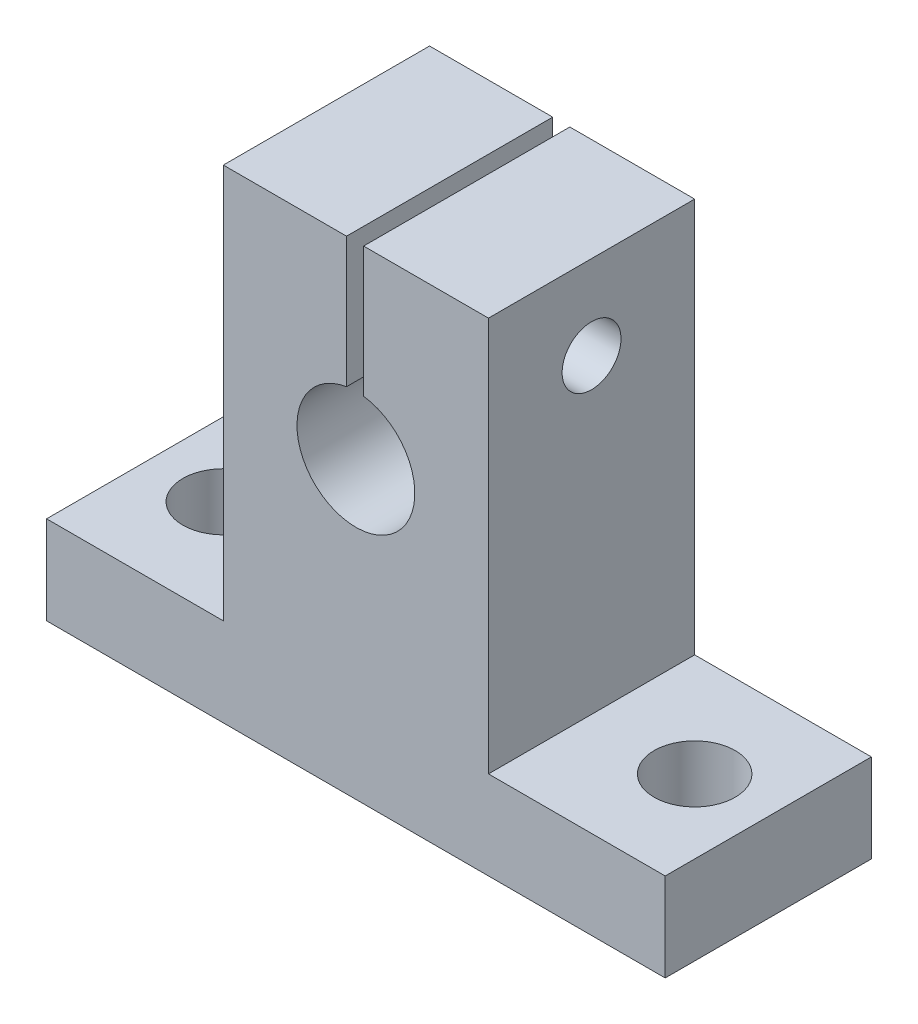
ISO-10303-21;
HEADER;
FILE_DESCRIPTION(('STEP AP214'),'2;1');
FILE_NAME('part.step','',(''),(''),'','','');
FILE_SCHEMA(('AUTOMOTIVE_DESIGN { 1 0 10303 214 1 1 1 1 }'));
ENDSEC;
DATA;
#1=APPLICATION_CONTEXT('core data for automotive mechanical design processes');
#2=APPLICATION_PROTOCOL_DEFINITION('international standard','automotive_design',2000,#1);
#3=PRODUCT_CONTEXT('',#1,'mechanical');
#4=PRODUCT('Part','Part','',(#3));
#5=PRODUCT_RELATED_PRODUCT_CATEGORY('part','',(#4));
#6=PRODUCT_DEFINITION_FORMATION('','',#4);
#7=PRODUCT_DEFINITION_CONTEXT('part definition',#1,'design');
#8=PRODUCT_DEFINITION('design','',#6,#7);
#9=PRODUCT_DEFINITION_SHAPE('','',#8);
#10=(LENGTH_UNIT() NAMED_UNIT(*) SI_UNIT(.MILLI.,.METRE.));
#11=(NAMED_UNIT(*) PLANE_ANGLE_UNIT() SI_UNIT($,.RADIAN.));
#12=(NAMED_UNIT(*) SI_UNIT($,.STERADIAN.) SOLID_ANGLE_UNIT());
#13=UNCERTAINTY_MEASURE_WITH_UNIT(LENGTH_MEASURE(1.E-05),#10,'distance_accuracy_value','');
#14=(GEOMETRIC_REPRESENTATION_CONTEXT(3) GLOBAL_UNCERTAINTY_ASSIGNED_CONTEXT((#13)) GLOBAL_UNIT_ASSIGNED_CONTEXT((#10,
#11,#12)) REPRESENTATION_CONTEXT('',''));
#15=CARTESIAN_POINT('',(0.,0.,0.));
#16=DIRECTION('',(0.,0.,1.));
#17=DIRECTION('',(1.,0.,0.));
#18=AXIS2_PLACEMENT_3D('',#15,#16,#17);
#19=CARTESIAN_POINT('',(0.,32.8,0.));
#20=DIRECTION('',(0.,1.,0.));
#21=DIRECTION('',(0.,0.,1.));
#22=AXIS2_PLACEMENT_3D('',#19,#20,#21);
#23=PLANE('',#22);
#24=DIRECTION('',(0.,0.,-1.));
#25=VECTOR('',#24,1.);
#26=CARTESIAN_POINT('',(7.16691514659286,32.8,8.10019646365425));
#27=LINE('',#26,#25);
#28=CARTESIAN_POINT('',(7.16691514659286,32.8,8.10019646365425));
#29=VERTEX_POINT('',#28);
#30=CARTESIAN_POINT('',(7.16691514659286,32.8,-5.89980353634575));
#31=VERTEX_POINT('',#30);
#32=EDGE_CURVE('E131',#29,#31,#27,.T.);
#33=ORIENTED_EDGE('',*,*,#32,.F.);
#34=DIRECTION('',(1.,0.,0.));
#35=VECTOR('',#34,1.);
#36=CARTESIAN_POINT('',(-2.35756385068762,32.8,8.10019646365425));
#37=LINE('',#36,#35);
#38=CARTESIAN_POINT('',(15.6424361493124,32.8,8.10019646365424));
#39=VERTEX_POINT('',#38);
#40=EDGE_CURVE('E151',#29,#39,#37,.T.);
#41=ORIENTED_EDGE('',*,*,#40,.T.);
#42=DIRECTION('',(0.,0.,-1.));
#43=VECTOR('',#42,1.);
#44=CARTESIAN_POINT('',(15.6424361493124,32.8,-5.89980353634575));
#45=LINE('',#44,#43);
#46=CARTESIAN_POINT('',(15.6424361493124,32.8,-5.89980353634575));
#47=VERTEX_POINT('',#46);
#48=EDGE_CURVE('E150',#39,#47,#45,.T.);
#49=ORIENTED_EDGE('',*,*,#48,.T.);
#50=DIRECTION('',(-1.,0.,0.));
#51=VECTOR('',#50,1.);
#52=CARTESIAN_POINT('',(-2.35756385068762,32.8,-5.89980353634575));
#53=LINE('',#52,#51);
#54=EDGE_CURVE('E158',#47,#31,#53,.T.);
#55=ORIENTED_EDGE('',*,*,#54,.T.);
#56=EDGE_LOOP('',(#33,#41,#49,#55));
#57=FACE_BOUND('',#56,.T.);
#58=ADVANCED_FACE('F37',(#57),#23,.T.);
#59=CARTESIAN_POINT('',(0.,6.,0.));
#60=DIRECTION('',(0.,1.,0.));
#61=DIRECTION('',(0.,0.,1.));
#62=AXIS2_PLACEMENT_3D('',#59,#60,#61);
#63=PLANE('',#62);
#64=DIRECTION('',(0.,0.,1.));
#65=VECTOR('',#64,1.);
#66=CARTESIAN_POINT('',(-2.35756385068762,6.,-5.89980353634575));
#67=LINE('',#66,#65);
#68=CARTESIAN_POINT('',(-2.35756385068762,6.,-5.89980353634575));
#69=VERTEX_POINT('',#68);
#70=CARTESIAN_POINT('',(-2.35756385068762,6.,8.10019646365425));
#71=VERTEX_POINT('',#70);
#72=EDGE_CURVE('E162',#69,#71,#67,.T.);
#73=ORIENTED_EDGE('',*,*,#72,.F.);
#74=DIRECTION('',(-1.,0.,0.));
#75=VECTOR('',#74,1.);
#76=CARTESIAN_POINT('',(-14.3575638506876,6.,-5.89980353634575));
#77=LINE('',#76,#75);
#78=CARTESIAN_POINT('',(-14.3575638506876,6.,-5.89980353634575));
#79=VERTEX_POINT('',#78);
#80=EDGE_CURVE('E201',#69,#79,#77,.T.);
#81=ORIENTED_EDGE('',*,*,#80,.T.);
#82=DIRECTION('',(0.,0.,1.));
#83=VECTOR('',#82,1.);
#84=CARTESIAN_POINT('',(-14.3575638506876,6.,-5.89980353634575));
#85=LINE('',#84,#83);
#86=CARTESIAN_POINT('',(-14.3575638506876,6.,8.10019646365425));
#87=VERTEX_POINT('',#86);
#88=EDGE_CURVE('E192',#79,#87,#85,.T.);
#89=ORIENTED_EDGE('',*,*,#88,.T.);
#90=DIRECTION('',(1.,0.,0.));
#91=VECTOR('',#90,1.);
#92=CARTESIAN_POINT('',(-14.3575638506876,6.,8.10019646365425));
#93=LINE('',#92,#91);
#94=EDGE_CURVE('E197',#87,#71,#93,.T.);
#95=ORIENTED_EDGE('',*,*,#94,.T.);
#96=EDGE_LOOP('',(#73,#81,#89,#95));
#97=FACE_BOUND('',#96,.T.);
#98=CARTESIAN_POINT('',(-9.35756385068762,6.,1.10019646365425));
#99=DIRECTION('',(0.,1.,0.));
#100=DIRECTION('',(0.,0.,1.));
#101=AXIS2_PLACEMENT_3D('',#98,#99,#100);
#102=CIRCLE('',#101,2.75);
#103=CARTESIAN_POINT('',(-9.35756385068762,6.,3.85019646365425));
#104=VERTEX_POINT('',#103);
#105=EDGE_CURVE('E184',#104,#104,#102,.T.);
#106=ORIENTED_EDGE('',*,*,#105,.F.);
#107=EDGE_LOOP('',(#106));
#108=FACE_BOUND('',#107,.T.);
#109=ADVANCED_FACE('F288',(#97,#108),#63,.T.);
#110=CARTESIAN_POINT('',(-14.3575638506876,6.,-5.89980353634575));
#111=DIRECTION('',(1.,0.,0.));
#112=DIRECTION('',(0.,0.,-1.));
#113=AXIS2_PLACEMENT_3D('',#110,#111,#112);
#114=PLANE('',#113);
#115=DIRECTION('',(0.,0.,1.));
#116=VECTOR('',#115,1.);
#117=CARTESIAN_POINT('',(-14.3575638506876,0.,-5.89980353634575));
#118=LINE('',#117,#116);
#119=CARTESIAN_POINT('',(-14.3575638506876,0.,-5.89980353634575));
#120=VERTEX_POINT('',#119);
#121=CARTESIAN_POINT('',(-14.3575638506876,0.,8.10019646365425));
#122=VERTEX_POINT('',#121);
#123=EDGE_CURVE('E183',#120,#122,#118,.T.);
#124=ORIENTED_EDGE('',*,*,#123,.T.);
#125=DIRECTION('',(0.,-1.,0.));
#126=VECTOR('',#125,1.);
#127=CARTESIAN_POINT('',(-14.3575638506876,6.,8.10019646365425));
#128=LINE('',#127,#126);
#129=EDGE_CURVE('E46',#87,#122,#128,.T.);
#130=ORIENTED_EDGE('',*,*,#129,.F.);
#131=ORIENTED_EDGE('',*,*,#88,.F.);
#132=DIRECTION('',(0.,-1.,0.));
#133=VECTOR('',#132,1.);
#134=CARTESIAN_POINT('',(-14.3575638506876,6.,-5.89980353634575));
#135=LINE('',#134,#133);
#136=EDGE_CURVE('E204',#79,#120,#135,.T.);
#137=ORIENTED_EDGE('',*,*,#136,.T.);
#138=EDGE_LOOP('',(#124,#130,#131,#137));
#139=FACE_BOUND('',#138,.T.);
#140=ADVANCED_FACE('F39',(#139),#114,.F.);
#141=CARTESIAN_POINT('',(-14.3575638506876,6.,8.10019646365425));
#142=DIRECTION('',(0.,0.,-1.));
#143=DIRECTION('',(-1.,0.,0.));
#144=AXIS2_PLACEMENT_3D('',#141,#142,#143);
#145=PLANE('',#144);
#146=ORIENTED_EDGE('',*,*,#40,.F.);
#147=DIRECTION('',(0.,-1.,0.));
#148=VECTOR('',#147,1.);
#149=CARTESIAN_POINT('',(7.16691514659286,32.8,8.10019646365425));
#150=LINE('',#149,#148);
#151=CARTESIAN_POINT('',(7.16691514659285,23.9654661493211,8.10019646365425));
#152=VERTEX_POINT('',#151);
#153=EDGE_CURVE('E144',#29,#152,#150,.T.);
#154=ORIENTED_EDGE('',*,*,#153,.T.);
#155=CARTESIAN_POINT('',(6.64243614931238,20.,8.10019646365425));
#156=DIRECTION('',(0.,0.,1.));
#157=DIRECTION('',(1.,0.,0.));
#158=AXIS2_PLACEMENT_3D('',#155,#156,#157);
#159=CIRCLE('',#158,4.);
#160=CARTESIAN_POINT('',(6.00568199429908,23.9489928014714,8.10019646365425));
#161=VERTEX_POINT('',#160);
#162=EDGE_CURVE('E143',#161,#152,#159,.T.);
#163=ORIENTED_EDGE('',*,*,#162,.F.);
#164=DIRECTION('',(0.,1.,0.));
#165=VECTOR('',#164,1.);
#166=CARTESIAN_POINT('',(6.00568199429908,32.8,8.10019646365425));
#167=LINE('',#166,#165);
#168=CARTESIAN_POINT('',(6.00568199429908,32.8,8.10019646365425));
#169=VERTEX_POINT('',#168);
#170=EDGE_CURVE('E53',#161,#169,#167,.T.);
#171=ORIENTED_EDGE('',*,*,#170,.T.);
#172=CARTESIAN_POINT('',(-2.35756385068762,32.8,8.10019646365425));
#173=VERTEX_POINT('',#172);
#174=EDGE_CURVE('E139',#173,#169,#37,.T.);
#175=ORIENTED_EDGE('',*,*,#174,.F.);
#176=DIRECTION('',(0.,-1.,0.));
#177=VECTOR('',#176,1.);
#178=CARTESIAN_POINT('',(-2.35756385068762,32.8,8.10019646365425));
#179=LINE('',#178,#177);
#180=EDGE_CURVE('E177',#173,#71,#179,.T.);
#181=ORIENTED_EDGE('',*,*,#180,.T.);
#182=ORIENTED_EDGE('',*,*,#94,.F.);
#183=ORIENTED_EDGE('',*,*,#129,.T.);
#184=DIRECTION('',(1.,0.,0.));
#185=VECTOR('',#184,1.);
#186=CARTESIAN_POINT('',(-14.3575638506876,0.,8.10019646365425));
#187=LINE('',#186,#185);
#188=CARTESIAN_POINT('',(27.6424361493124,0.,8.10019646365425));
#189=VERTEX_POINT('',#188);
#190=EDGE_CURVE('E207',#122,#189,#187,.T.);
#191=ORIENTED_EDGE('',*,*,#190,.T.);
#192=DIRECTION('',(0.,-1.,0.));
#193=VECTOR('',#192,1.);
#194=CARTESIAN_POINT('',(27.6424361493124,6.,8.10019646365425));
#195=LINE('',#194,#193);
#196=CARTESIAN_POINT('',(27.6424361493124,6.,8.10019646365425));
#197=VERTEX_POINT('',#196);
#198=EDGE_CURVE('E217',#197,#189,#195,.T.);
#199=ORIENTED_EDGE('',*,*,#198,.F.);
#200=CARTESIAN_POINT('',(15.6424361493124,6.,8.10019646365425));
#201=VERTEX_POINT('',#200);
#202=EDGE_CURVE('E195',#201,#197,#93,.T.);
#203=ORIENTED_EDGE('',*,*,#202,.F.);
#204=DIRECTION('',(0.,-1.,0.));
#205=VECTOR('',#204,1.);
#206=CARTESIAN_POINT('',(15.6424361493124,32.8,8.10019646365424));
#207=LINE('',#206,#205);
#208=EDGE_CURVE('E174',#39,#201,#207,.T.);
#209=ORIENTED_EDGE('',*,*,#208,.F.);
#210=EDGE_LOOP('',(#146,#154,#163,#171,#175,#181,#182,#183,#191,#199,#203,#209));
#211=FACE_BOUND('',#210,.T.);
#212=ADVANCED_FACE('F137',(#211),#145,.F.);
#213=CARTESIAN_POINT('',(27.6424361493124,6.,-5.89980353634575));
#214=DIRECTION('',(-1.,0.,0.));
#215=DIRECTION('',(0.,0.,1.));
#216=AXIS2_PLACEMENT_3D('',#213,#214,#215);
#217=PLANE('',#216);
#218=DIRECTION('',(0.,0.,-1.));
#219=VECTOR('',#218,1.);
#220=CARTESIAN_POINT('',(27.6424361493124,0.,-5.89980353634575));
#221=LINE('',#220,#219);
#222=CARTESIAN_POINT('',(27.6424361493124,0.,-5.89980353634575));
#223=VERTEX_POINT('',#222);
#224=EDGE_CURVE('E209',#189,#223,#221,.T.);
#225=ORIENTED_EDGE('',*,*,#224,.T.);
#226=DIRECTION('',(0.,-1.,0.));
#227=VECTOR('',#226,1.);
#228=CARTESIAN_POINT('',(27.6424361493124,6.,-5.89980353634575));
#229=LINE('',#228,#227);
#230=CARTESIAN_POINT('',(27.6424361493124,6.,-5.89980353634575));
#231=VERTEX_POINT('',#230);
#232=EDGE_CURVE('E214',#231,#223,#229,.T.);
#233=ORIENTED_EDGE('',*,*,#232,.F.);
#234=DIRECTION('',(0.,0.,-1.));
#235=VECTOR('',#234,1.);
#236=CARTESIAN_POINT('',(27.6424361493124,6.,-5.89980353634575));
#237=LINE('',#236,#235);
#238=EDGE_CURVE('E199',#197,#231,#237,.T.);
#239=ORIENTED_EDGE('',*,*,#238,.F.);
#240=ORIENTED_EDGE('',*,*,#198,.T.);
#241=EDGE_LOOP('',(#225,#233,#239,#240));
#242=FACE_BOUND('',#241,.T.);
#243=ADVANCED_FACE('F233',(#242),#217,.F.);
#244=CARTESIAN_POINT('',(-14.3575638506876,6.,-5.89980353634575));
#245=DIRECTION('',(0.,0.,1.));
#246=DIRECTION('',(1.,0.,0.));
#247=AXIS2_PLACEMENT_3D('',#244,#245,#246);
#248=PLANE('',#247);
#249=CARTESIAN_POINT('',(6.64243614931238,20.,-5.89980353634575));
#250=DIRECTION('',(0.,0.,1.));
#251=DIRECTION('',(1.,0.,0.));
#252=AXIS2_PLACEMENT_3D('',#249,#250,#251);
#253=CIRCLE('',#252,4.);
#254=CARTESIAN_POINT('',(6.00568199429908,23.9489928014714,-5.89980353634575));
#255=VERTEX_POINT('',#254);
#256=CARTESIAN_POINT('',(7.16691514659285,23.9654661493211,-5.89980353634575));
#257=VERTEX_POINT('',#256);
#258=EDGE_CURVE('E166',#255,#257,#253,.T.);
#259=ORIENTED_EDGE('',*,*,#258,.T.);
#260=DIRECTION('',(0.,-1.,0.));
#261=VECTOR('',#260,1.);
#262=CARTESIAN_POINT('',(7.16691514659286,32.8,-5.89980353634575));
#263=LINE('',#262,#261);
#264=EDGE_CURVE('E61',#31,#257,#263,.T.);
#265=ORIENTED_EDGE('',*,*,#264,.F.);
#266=ORIENTED_EDGE('',*,*,#54,.F.);
#267=DIRECTION('',(0.,-1.,0.));
#268=VECTOR('',#267,1.);
#269=CARTESIAN_POINT('',(15.6424361493124,32.8,-5.89980353634575));
#270=LINE('',#269,#268);
#271=CARTESIAN_POINT('',(15.6424361493124,6.,-5.89980353634575));
#272=VERTEX_POINT('',#271);
#273=EDGE_CURVE('E171',#47,#272,#270,.T.);
#274=ORIENTED_EDGE('',*,*,#273,.T.);
#275=EDGE_CURVE('E202',#231,#272,#77,.T.);
#276=ORIENTED_EDGE('',*,*,#275,.F.);
#277=ORIENTED_EDGE('',*,*,#232,.T.);
#278=DIRECTION('',(-1.,0.,0.));
#279=VECTOR('',#278,1.);
#280=CARTESIAN_POINT('',(-14.3575638506876,0.,-5.89980353634575));
#281=LINE('',#280,#279);
#282=EDGE_CURVE('E196',#223,#120,#281,.T.);
#283=ORIENTED_EDGE('',*,*,#282,.T.);
#284=ORIENTED_EDGE('',*,*,#136,.F.);
#285=ORIENTED_EDGE('',*,*,#80,.F.);
#286=DIRECTION('',(0.,-1.,0.));
#287=VECTOR('',#286,1.);
#288=CARTESIAN_POINT('',(-2.35756385068762,32.8,-5.89980353634575));
#289=LINE('',#288,#287);
#290=CARTESIAN_POINT('',(-2.35756385068762,32.8,-5.89980353634575));
#291=VERTEX_POINT('',#290);
#292=EDGE_CURVE('E161',#291,#69,#289,.T.);
#293=ORIENTED_EDGE('',*,*,#292,.F.);
#294=CARTESIAN_POINT('',(6.00568199429908,32.8,-5.89980353634575));
#295=VERTEX_POINT('',#294);
#296=EDGE_CURVE('E153',#295,#291,#53,.T.);
#297=ORIENTED_EDGE('',*,*,#296,.F.);
#298=DIRECTION('',(0.,1.,0.));
#299=VECTOR('',#298,1.);
#300=CARTESIAN_POINT('',(6.00568199429908,32.8,-5.89980353634575));
#301=LINE('',#300,#299);
#302=EDGE_CURVE('E127',#255,#295,#301,.T.);
#303=ORIENTED_EDGE('',*,*,#302,.F.);
#304=EDGE_LOOP('',(#259,#265,#266,#274,#276,#277,#283,#284,#285,#293,#297,#303));
#305=FACE_BOUND('',#304,.T.);
#306=ADVANCED_FACE('F238',(#305),#248,.F.);
#307=DIRECTION('',(0.,0.,-1.));
#308=VECTOR('',#307,1.);
#309=CARTESIAN_POINT('',(15.6424361493124,6.,-5.89980353634575));
#310=LINE('',#309,#308);
#311=EDGE_CURVE('E165',#201,#272,#310,.T.);
#312=ORIENTED_EDGE('',*,*,#311,.F.);
#313=ORIENTED_EDGE('',*,*,#202,.T.);
#314=ORIENTED_EDGE('',*,*,#238,.T.);
#315=ORIENTED_EDGE('',*,*,#275,.T.);
#316=EDGE_LOOP('',(#312,#313,#314,#315));
#317=FACE_BOUND('',#316,.T.);
#318=CARTESIAN_POINT('',(22.6424361493124,6.,1.10019646365425));
#319=DIRECTION('',(0.,1.,0.));
#320=DIRECTION('',(0.,0.,1.));
#321=AXIS2_PLACEMENT_3D('',#318,#319,#320);
#322=CIRCLE('',#321,2.75);
#323=CARTESIAN_POINT('',(22.6424361493124,6.,3.85019646365424));
#324=VERTEX_POINT('',#323);
#325=EDGE_CURVE('E179',#324,#324,#322,.T.);
#326=ORIENTED_EDGE('',*,*,#325,.F.);
#327=EDGE_LOOP('',(#326));
#328=FACE_BOUND('',#327,.T.);
#329=ADVANCED_FACE('F242',(#317,#328),#63,.T.);
#330=CARTESIAN_POINT('',(0.,0.,0.));
#331=DIRECTION('',(0.,1.,0.));
#332=DIRECTION('',(0.,0.,1.));
#333=AXIS2_PLACEMENT_3D('',#330,#331,#332);
#334=PLANE('',#333);
#335=CARTESIAN_POINT('',(-9.35756385068762,0.,1.10019646365425));
#336=DIRECTION('',(0.,1.,0.));
#337=DIRECTION('',(0.,0.,1.));
#338=AXIS2_PLACEMENT_3D('',#335,#336,#337);
#339=CIRCLE('',#338,2.75);
#340=CARTESIAN_POINT('',(-9.35756385068762,0.,3.85019646365425));
#341=VERTEX_POINT('',#340);
#342=EDGE_CURVE('E180',#341,#341,#339,.T.);
#343=ORIENTED_EDGE('',*,*,#342,.T.);
#344=EDGE_LOOP('',(#343));
#345=FACE_BOUND('',#344,.T.);
#346=CARTESIAN_POINT('',(22.6424361493124,0.,1.10019646365425));
#347=DIRECTION('',(0.,1.,0.));
#348=DIRECTION('',(0.,0.,1.));
#349=AXIS2_PLACEMENT_3D('',#346,#347,#348);
#350=CIRCLE('',#349,2.75);
#351=CARTESIAN_POINT('',(22.6424361493124,0.,3.85019646365424));
#352=VERTEX_POINT('',#351);
#353=EDGE_CURVE('E187',#352,#352,#350,.T.);
#354=ORIENTED_EDGE('',*,*,#353,.T.);
#355=EDGE_LOOP('',(#354));
#356=FACE_BOUND('',#355,.T.);
#357=ORIENTED_EDGE('',*,*,#123,.F.);
#358=ORIENTED_EDGE('',*,*,#282,.F.);
#359=ORIENTED_EDGE('',*,*,#224,.F.);
#360=ORIENTED_EDGE('',*,*,#190,.F.);
#361=EDGE_LOOP('',(#357,#358,#359,#360));
#362=FACE_BOUND('',#361,.T.);
#363=ADVANCED_FACE('F229',(#345,#356,#362),#334,.F.);
#364=CARTESIAN_POINT('',(22.6424361493124,0.,1.10019646365425));
#365=DIRECTION('',(0.,1.,0.));
#366=DIRECTION('',(0.,0.,1.));
#367=AXIS2_PLACEMENT_3D('',#364,#365,#366);
#368=CYLINDRICAL_SURFACE('',#367,2.75);
#369=ORIENTED_EDGE('',*,*,#353,.F.);
#370=EDGE_LOOP('',(#369));
#371=FACE_BOUND('',#370,.T.);
#372=ORIENTED_EDGE('',*,*,#325,.T.);
#373=EDGE_LOOP('',(#372));
#374=FACE_BOUND('',#373,.T.);
#375=ADVANCED_FACE('F295',(#371,#374),#368,.F.);
#376=CARTESIAN_POINT('',(-9.35756385068762,0.,1.10019646365425));
#377=DIRECTION('',(0.,1.,0.));
#378=DIRECTION('',(0.,0.,1.));
#379=AXIS2_PLACEMENT_3D('',#376,#377,#378);
#380=CYLINDRICAL_SURFACE('',#379,2.75);
#381=ORIENTED_EDGE('',*,*,#342,.F.);
#382=EDGE_LOOP('',(#381));
#383=FACE_BOUND('',#382,.T.);
#384=ORIENTED_EDGE('',*,*,#105,.T.);
#385=EDGE_LOOP('',(#384));
#386=FACE_BOUND('',#385,.T.);
#387=ADVANCED_FACE('F283',(#383,#386),#380,.F.);
#388=CARTESIAN_POINT('',(-2.35756385068762,32.8,-5.89980353634575));
#389=DIRECTION('',(1.,0.,0.));
#390=DIRECTION('',(0.,0.,-1.));
#391=AXIS2_PLACEMENT_3D('',#388,#389,#390);
#392=PLANE('',#391);
#393=CARTESIAN_POINT('',(-2.35756385068762,27.0916059656513,1.10019646365425));
#394=DIRECTION('',(-1.,0.,0.));
#395=DIRECTION('',(0.,0.,1.));
#396=AXIS2_PLACEMENT_3D('',#393,#394,#395);
#397=CIRCLE('',#396,2.);
#398=CARTESIAN_POINT('',(-2.35756385068762,27.0916059656513,3.10019646365425));
#399=VERTEX_POINT('',#398);
#400=EDGE_CURVE('E272',#399,#399,#397,.T.);
#401=ORIENTED_EDGE('',*,*,#400,.F.);
#402=EDGE_LOOP('',(#401));
#403=FACE_BOUND('',#402,.T.);
#404=ORIENTED_EDGE('',*,*,#72,.T.);
#405=ORIENTED_EDGE('',*,*,#180,.F.);
#406=DIRECTION('',(0.,0.,1.));
#407=VECTOR('',#406,1.);
#408=CARTESIAN_POINT('',(-2.35756385068762,32.8,-5.89980353634575));
#409=LINE('',#408,#407);
#410=EDGE_CURVE('E148',#291,#173,#409,.T.);
#411=ORIENTED_EDGE('',*,*,#410,.F.);
#412=ORIENTED_EDGE('',*,*,#292,.T.);
#413=EDGE_LOOP('',(#404,#405,#411,#412));
#414=FACE_BOUND('',#413,.T.);
#415=ADVANCED_FACE('F280',(#403,#414),#392,.F.);
#416=CARTESIAN_POINT('',(15.6424361493124,32.8,-5.89980353634575));
#417=DIRECTION('',(-1.,0.,0.));
#418=DIRECTION('',(0.,0.,1.));
#419=AXIS2_PLACEMENT_3D('',#416,#417,#418);
#420=PLANE('',#419);
#421=CARTESIAN_POINT('',(15.6424361493124,27.0916059656513,1.10019646365424));
#422=DIRECTION('',(-1.,0.,0.));
#423=DIRECTION('',(0.,0.,1.));
#424=AXIS2_PLACEMENT_3D('',#421,#422,#423);
#425=CIRCLE('',#424,2.);
#426=CARTESIAN_POINT('',(15.6424361493124,27.0916059656513,3.10019646365424));
#427=VERTEX_POINT('',#426);
#428=EDGE_CURVE('E262',#427,#427,#425,.T.);
#429=ORIENTED_EDGE('',*,*,#428,.T.);
#430=EDGE_LOOP('',(#429));
#431=FACE_BOUND('',#430,.T.);
#432=ORIENTED_EDGE('',*,*,#311,.T.);
#433=ORIENTED_EDGE('',*,*,#273,.F.);
#434=ORIENTED_EDGE('',*,*,#48,.F.);
#435=ORIENTED_EDGE('',*,*,#208,.T.);
#436=EDGE_LOOP('',(#432,#433,#434,#435));
#437=FACE_BOUND('',#436,.T.);
#438=ADVANCED_FACE('F246',(#431,#437),#420,.F.);
#439=DIRECTION('',(0.,0.,-1.));
#440=VECTOR('',#439,1.);
#441=CARTESIAN_POINT('',(6.00568199429908,32.8,8.10019646365425));
#442=LINE('',#441,#440);
#443=EDGE_CURVE('E124',#169,#295,#442,.T.);
#444=ORIENTED_EDGE('',*,*,#443,.T.);
#445=ORIENTED_EDGE('',*,*,#296,.T.);
#446=ORIENTED_EDGE('',*,*,#410,.T.);
#447=ORIENTED_EDGE('',*,*,#174,.T.);
#448=EDGE_LOOP('',(#444,#445,#446,#447));
#449=FACE_BOUND('',#448,.T.);
#450=ADVANCED_FACE('F146',(#449),#23,.T.);
#451=CARTESIAN_POINT('',(6.64243614931238,20.,-5.89980353634575));
#452=DIRECTION('',(0.,0.,1.));
#453=DIRECTION('',(1.,0.,0.));
#454=AXIS2_PLACEMENT_3D('',#451,#452,#453);
#455=CYLINDRICAL_SURFACE('',#454,4.);
#456=ORIENTED_EDGE('',*,*,#162,.T.);
#457=DIRECTION('',(0.,0.,1.));
#458=VECTOR('',#457,1.);
#459=CARTESIAN_POINT('',(7.16691514659285,23.9654661493211,-5.89980353634575));
#460=LINE('',#459,#458);
#461=EDGE_CURVE('E11',#152,#257,#460,.F.);
#462=ORIENTED_EDGE('',*,*,#461,.T.);
#463=ORIENTED_EDGE('',*,*,#258,.F.);
#464=DIRECTION('',(0.,0.,-1.));
#465=VECTOR('',#464,1.);
#466=CARTESIAN_POINT('',(6.00568199429908,23.9489928014714,8.10019646365425));
#467=LINE('',#466,#465);
#468=EDGE_CURVE('E132',#161,#255,#467,.T.);
#469=ORIENTED_EDGE('',*,*,#468,.F.);
#470=EDGE_LOOP('',(#456,#462,#463,#469));
#471=FACE_BOUND('',#470,.T.);
#472=ADVANCED_FACE('F258',(#471),#455,.F.);
#473=CARTESIAN_POINT('',(6.00568199429908,32.8,8.10019646365425));
#474=DIRECTION('',(-1.,0.,0.));
#475=DIRECTION('',(0.,-1.,0.));
#476=AXIS2_PLACEMENT_3D('',#473,#474,#475);
#477=PLANE('',#476);
#478=CARTESIAN_POINT('',(6.00568199429908,27.0916059656513,1.10019646365424));
#479=DIRECTION('',(-1.,0.,0.));
#480=DIRECTION('',(0.,-1.,0.));
#481=AXIS2_PLACEMENT_3D('',#478,#479,#480);
#482=CIRCLE('',#481,2.);
#483=CARTESIAN_POINT('',(6.00568199429908,25.0916059656513,1.10019646365424));
#484=VERTEX_POINT('',#483);
#485=EDGE_CURVE('E265',#484,#484,#482,.T.);
#486=ORIENTED_EDGE('',*,*,#485,.T.);
#487=EDGE_LOOP('',(#486));
#488=FACE_BOUND('',#487,.T.);
#489=ORIENTED_EDGE('',*,*,#302,.T.);
#490=ORIENTED_EDGE('',*,*,#443,.F.);
#491=ORIENTED_EDGE('',*,*,#170,.F.);
#492=ORIENTED_EDGE('',*,*,#468,.T.);
#493=EDGE_LOOP('',(#489,#490,#491,#492));
#494=FACE_BOUND('',#493,.T.);
#495=ADVANCED_FACE('F125',(#488,#494),#477,.F.);
#496=CARTESIAN_POINT('',(7.16691514659286,32.8,8.10019646365425));
#497=DIRECTION('',(1.,0.,0.));
#498=DIRECTION('',(0.,1.,0.));
#499=AXIS2_PLACEMENT_3D('',#496,#497,#498);
#500=PLANE('',#499);
#501=CARTESIAN_POINT('',(7.16691514659286,27.0916059656513,1.10019646365424));
#502=DIRECTION('',(1.,0.,0.));
#503=DIRECTION('',(0.,1.,0.));
#504=AXIS2_PLACEMENT_3D('',#501,#502,#503);
#505=CIRCLE('',#504,2.);
#506=CARTESIAN_POINT('',(7.16691514659286,29.0916059656513,1.10019646365424));
#507=VERTEX_POINT('',#506);
#508=EDGE_CURVE('E41',#507,#507,#505,.T.);
#509=ORIENTED_EDGE('',*,*,#508,.T.);
#510=EDGE_LOOP('',(#509));
#511=FACE_BOUND('',#510,.T.);
#512=ORIENTED_EDGE('',*,*,#153,.F.);
#513=ORIENTED_EDGE('',*,*,#32,.T.);
#514=ORIENTED_EDGE('',*,*,#264,.T.);
#515=ORIENTED_EDGE('',*,*,#461,.F.);
#516=EDGE_LOOP('',(#512,#513,#514,#515));
#517=FACE_BOUND('',#516,.T.);
#518=ADVANCED_FACE('F259',(#511,#517),#500,.F.);
#519=CARTESIAN_POINT('',(27.6424361493124,27.0916059656513,1.10019646365424));
#520=DIRECTION('',(-1.,0.,0.));
#521=DIRECTION('',(0.,0.,1.));
#522=AXIS2_PLACEMENT_3D('',#519,#520,#521);
#523=CYLINDRICAL_SURFACE('',#522,2.);
#524=ORIENTED_EDGE('',*,*,#508,.F.);
#525=EDGE_LOOP('',(#524));
#526=FACE_BOUND('',#525,.T.);
#527=ORIENTED_EDGE('',*,*,#428,.F.);
#528=EDGE_LOOP('',(#527));
#529=FACE_BOUND('',#528,.T.);
#530=ADVANCED_FACE('F424',(#526,#529),#523,.F.);
#531=ORIENTED_EDGE('',*,*,#400,.T.);
#532=EDGE_LOOP('',(#531));
#533=FACE_BOUND('',#532,.T.);
#534=ORIENTED_EDGE('',*,*,#485,.F.);
#535=EDGE_LOOP('',(#534));
#536=FACE_BOUND('',#535,.T.);
#537=ADVANCED_FACE('F277',(#533,#536),#523,.F.);
#538=CLOSED_SHELL('',(#58,#109,#140,#212,#243,#306,#329,#363,#375,#387,#415,#438,#450,#472,#495,
#518,#530,#537));
#539=MANIFOLD_SOLID_BREP('B2',#538);
#540=ADVANCED_BREP_SHAPE_REPRESENTATION('',(#18,#539),#14);
#541=SHAPE_DEFINITION_REPRESENTATION(#9,#540);
ENDSEC;
END-ISO-10303-21;
